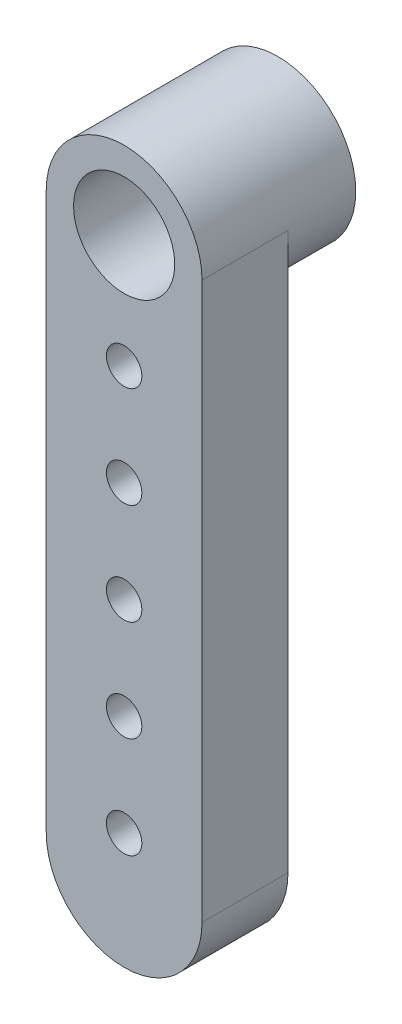
ISO-10303-21;
HEADER;
FILE_DESCRIPTION(('STEP AP214'),'2;1');
FILE_NAME('part.step','',(''),(''),'','','');
FILE_SCHEMA(('AUTOMOTIVE_DESIGN { 1 0 10303 214 1 1 1 1 }'));
ENDSEC;
DATA;
#1=APPLICATION_CONTEXT('core data for automotive mechanical design processes');
#2=APPLICATION_PROTOCOL_DEFINITION('international standard','automotive_design',2000,#1);
#3=PRODUCT_CONTEXT('',#1,'mechanical');
#4=PRODUCT('Part','Part','',(#3));
#5=PRODUCT_RELATED_PRODUCT_CATEGORY('part','',(#4));
#6=PRODUCT_DEFINITION_FORMATION('','',#4);
#7=PRODUCT_DEFINITION_CONTEXT('part definition',#1,'design');
#8=PRODUCT_DEFINITION('design','',#6,#7);
#9=PRODUCT_DEFINITION_SHAPE('','',#8);
#10=(LENGTH_UNIT() NAMED_UNIT(*) SI_UNIT(.MILLI.,.METRE.));
#11=(NAMED_UNIT(*) PLANE_ANGLE_UNIT() SI_UNIT($,.RADIAN.));
#12=(NAMED_UNIT(*) SI_UNIT($,.STERADIAN.) SOLID_ANGLE_UNIT());
#13=UNCERTAINTY_MEASURE_WITH_UNIT(LENGTH_MEASURE(1.E-05),#10,'distance_accuracy_value','');
#14=(GEOMETRIC_REPRESENTATION_CONTEXT(3) GLOBAL_UNCERTAINTY_ASSIGNED_CONTEXT((#13)) GLOBAL_UNIT_ASSIGNED_CONTEXT((#10,
#11,#12)) REPRESENTATION_CONTEXT('',''));
#15=CARTESIAN_POINT('',(0.,0.,0.));
#16=DIRECTION('',(0.,0.,1.));
#17=DIRECTION('',(1.,0.,0.));
#18=AXIS2_PLACEMENT_3D('',#15,#16,#17);
#19=CARTESIAN_POINT('',(1.9558,0.,-2.159));
#20=DIRECTION('',(-1.,0.,0.));
#21=DIRECTION('',(0.,-1.,0.));
#22=AXIS2_PLACEMENT_3D('',#19,#20,#21);
#23=PLANE('',#22);
#24=DIRECTION('',(0.,-1.,0.));
#25=VECTOR('',#24,1.);
#26=CARTESIAN_POINT('',(1.9558,0.,0.));
#27=LINE('',#26,#25);
#28=CARTESIAN_POINT('',(1.9558,0.,0.));
#29=VERTEX_POINT('',#28);
#30=CARTESIAN_POINT('',(1.9558,-13.97,0.));
#31=VERTEX_POINT('',#30);
#32=EDGE_CURVE('E81',#29,#31,#27,.T.);
#33=ORIENTED_EDGE('',*,*,#32,.T.);
#34=DIRECTION('',(0.,0.,1.));
#35=VECTOR('',#34,1.);
#36=CARTESIAN_POINT('',(1.9558,-13.97,-2.159));
#37=LINE('',#36,#35);
#38=CARTESIAN_POINT('',(1.9558,-13.97,-2.159));
#39=VERTEX_POINT('',#38);
#40=EDGE_CURVE('E45',#39,#31,#37,.T.);
#41=ORIENTED_EDGE('',*,*,#40,.F.);
#42=DIRECTION('',(0.,-1.,0.));
#43=VECTOR('',#42,1.);
#44=CARTESIAN_POINT('',(1.9558,0.,-2.159));
#45=LINE('',#44,#43);
#46=CARTESIAN_POINT('',(1.9558,0.,-2.159));
#47=VERTEX_POINT('',#46);
#48=EDGE_CURVE('E53',#47,#39,#45,.T.);
#49=ORIENTED_EDGE('',*,*,#48,.F.);
#50=DIRECTION('',(0.,0.,1.));
#51=VECTOR('',#50,1.);
#52=CARTESIAN_POINT('',(1.9558,0.,-2.159));
#53=LINE('',#52,#51);
#54=EDGE_CURVE('E11',#47,#29,#53,.T.);
#55=ORIENTED_EDGE('',*,*,#54,.T.);
#56=EDGE_LOOP('',(#33,#41,#49,#55));
#57=FACE_BOUND('',#56,.T.);
#58=ADVANCED_FACE('F35',(#57),#23,.F.);
#59=CARTESIAN_POINT('',(0.,-13.97,-2.159));
#60=DIRECTION('',(0.,0.,1.));
#61=DIRECTION('',(1.,0.,0.));
#62=AXIS2_PLACEMENT_3D('',#59,#60,#61);
#63=CYLINDRICAL_SURFACE('',#62,1.9558);
#64=CARTESIAN_POINT('',(0.,-13.97,0.));
#65=DIRECTION('',(0.,0.,1.));
#66=DIRECTION('',(1.,0.,0.));
#67=AXIS2_PLACEMENT_3D('',#64,#65,#66);
#68=CIRCLE('',#67,1.9558);
#69=CARTESIAN_POINT('',(-1.9558,-13.97,0.));
#70=VERTEX_POINT('',#69);
#71=EDGE_CURVE('E91',#70,#31,#68,.T.);
#72=ORIENTED_EDGE('',*,*,#71,.F.);
#73=DIRECTION('',(0.,0.,1.));
#74=VECTOR('',#73,1.);
#75=CARTESIAN_POINT('',(-1.9558,-13.97,-2.159));
#76=LINE('',#75,#74);
#77=CARTESIAN_POINT('',(-1.9558,-13.97,-2.159));
#78=VERTEX_POINT('',#77);
#79=EDGE_CURVE('E67',#78,#70,#76,.T.);
#80=ORIENTED_EDGE('',*,*,#79,.F.);
#81=CARTESIAN_POINT('',(0.,-13.97,-2.159));
#82=DIRECTION('',(0.,0.,1.));
#83=DIRECTION('',(1.,0.,0.));
#84=AXIS2_PLACEMENT_3D('',#81,#82,#83);
#85=CIRCLE('',#84,1.9558);
#86=EDGE_CURVE('E124',#78,#39,#85,.T.);
#87=ORIENTED_EDGE('',*,*,#86,.T.);
#88=ORIENTED_EDGE('',*,*,#40,.T.);
#89=EDGE_LOOP('',(#72,#80,#87,#88));
#90=FACE_BOUND('',#89,.T.);
#91=ADVANCED_FACE('F159',(#90),#63,.T.);
#92=CARTESIAN_POINT('',(0.,-13.0048,-2.159));
#93=DIRECTION('',(0.,0.,1.));
#94=DIRECTION('',(1.,0.,0.));
#95=AXIS2_PLACEMENT_3D('',#92,#93,#94);
#96=CYLINDRICAL_SURFACE('',#95,0.4445);
#97=CARTESIAN_POINT('',(0.,-13.0048,-2.159));
#98=DIRECTION('',(0.,0.,1.));
#99=DIRECTION('',(1.,0.,0.));
#100=AXIS2_PLACEMENT_3D('',#97,#98,#99);
#101=CIRCLE('',#100,0.4445);
#102=CARTESIAN_POINT('',(0.444500000000001,-13.0048,-2.159));
#103=VERTEX_POINT('',#102);
#104=EDGE_CURVE('E117',#103,#103,#101,.T.);
#105=ORIENTED_EDGE('',*,*,#104,.F.);
#106=EDGE_LOOP('',(#105));
#107=FACE_BOUND('',#106,.T.);
#108=CARTESIAN_POINT('',(0.,-13.0048,0.));
#109=DIRECTION('',(0.,0.,1.));
#110=DIRECTION('',(1.,0.,0.));
#111=AXIS2_PLACEMENT_3D('',#108,#109,#110);
#112=CIRCLE('',#111,0.4445);
#113=CARTESIAN_POINT('',(0.444500000000001,-13.0048,0.));
#114=VERTEX_POINT('',#113);
#115=EDGE_CURVE('E138',#114,#114,#112,.T.);
#116=ORIENTED_EDGE('',*,*,#115,.T.);
#117=EDGE_LOOP('',(#116));
#118=FACE_BOUND('',#117,.T.);
#119=ADVANCED_FACE('F164',(#107,#118),#96,.F.);
#120=CARTESIAN_POINT('',(0.,-10.4648,-2.159));
#121=DIRECTION('',(0.,0.,1.));
#122=DIRECTION('',(1.,0.,0.));
#123=AXIS2_PLACEMENT_3D('',#120,#121,#122);
#124=CYLINDRICAL_SURFACE('',#123,0.4445);
#125=CARTESIAN_POINT('',(0.,-10.4648,-2.159));
#126=DIRECTION('',(0.,0.,1.));
#127=DIRECTION('',(1.,0.,0.));
#128=AXIS2_PLACEMENT_3D('',#125,#126,#127);
#129=CIRCLE('',#128,0.4445);
#130=CARTESIAN_POINT('',(0.444499999999993,-10.4648,-2.159));
#131=VERTEX_POINT('',#130);
#132=EDGE_CURVE('E114',#131,#131,#129,.T.);
#133=ORIENTED_EDGE('',*,*,#132,.F.);
#134=EDGE_LOOP('',(#133));
#135=FACE_BOUND('',#134,.T.);
#136=CARTESIAN_POINT('',(0.,-10.4648,0.));
#137=DIRECTION('',(0.,0.,1.));
#138=DIRECTION('',(1.,0.,0.));
#139=AXIS2_PLACEMENT_3D('',#136,#137,#138);
#140=CIRCLE('',#139,0.4445);
#141=CARTESIAN_POINT('',(0.444499999999993,-10.4648,0.));
#142=VERTEX_POINT('',#141);
#143=EDGE_CURVE('E135',#142,#142,#140,.T.);
#144=ORIENTED_EDGE('',*,*,#143,.T.);
#145=EDGE_LOOP('',(#144));
#146=FACE_BOUND('',#145,.T.);
#147=ADVANCED_FACE('F199',(#135,#146),#124,.F.);
#148=CARTESIAN_POINT('',(0.,-7.9248,-2.159));
#149=DIRECTION('',(0.,0.,1.));
#150=DIRECTION('',(1.,0.,0.));
#151=AXIS2_PLACEMENT_3D('',#148,#149,#150);
#152=CYLINDRICAL_SURFACE('',#151,0.4445);
#153=CARTESIAN_POINT('',(0.,-7.9248,-2.159));
#154=DIRECTION('',(0.,0.,1.));
#155=DIRECTION('',(1.,0.,0.));
#156=AXIS2_PLACEMENT_3D('',#153,#154,#155);
#157=CIRCLE('',#156,0.4445);
#158=CARTESIAN_POINT('',(0.444499999999983,-7.9248,-2.159));
#159=VERTEX_POINT('',#158);
#160=EDGE_CURVE('E111',#159,#159,#157,.T.);
#161=ORIENTED_EDGE('',*,*,#160,.F.);
#162=EDGE_LOOP('',(#161));
#163=FACE_BOUND('',#162,.T.);
#164=CARTESIAN_POINT('',(0.,-7.9248,0.));
#165=DIRECTION('',(0.,0.,1.));
#166=DIRECTION('',(1.,0.,0.));
#167=AXIS2_PLACEMENT_3D('',#164,#165,#166);
#168=CIRCLE('',#167,0.4445);
#169=CARTESIAN_POINT('',(0.444499999999983,-7.9248,0.));
#170=VERTEX_POINT('',#169);
#171=EDGE_CURVE('E132',#170,#170,#168,.T.);
#172=ORIENTED_EDGE('',*,*,#171,.T.);
#173=EDGE_LOOP('',(#172));
#174=FACE_BOUND('',#173,.T.);
#175=ADVANCED_FACE('F204',(#163,#174),#152,.F.);
#176=CARTESIAN_POINT('',(0.,-5.3848,-2.159));
#177=DIRECTION('',(0.,0.,1.));
#178=DIRECTION('',(1.,0.,0.));
#179=AXIS2_PLACEMENT_3D('',#176,#177,#178);
#180=CYLINDRICAL_SURFACE('',#179,0.444499999999999);
#181=CARTESIAN_POINT('',(0.,-5.3848,-2.159));
#182=DIRECTION('',(0.,0.,1.));
#183=DIRECTION('',(1.,0.,0.));
#184=AXIS2_PLACEMENT_3D('',#181,#182,#183);
#185=CIRCLE('',#184,0.444499999999999);
#186=CARTESIAN_POINT('',(0.444499999999974,-5.3848,-2.159));
#187=VERTEX_POINT('',#186);
#188=EDGE_CURVE('E108',#187,#187,#185,.T.);
#189=ORIENTED_EDGE('',*,*,#188,.F.);
#190=EDGE_LOOP('',(#189));
#191=FACE_BOUND('',#190,.T.);
#192=CARTESIAN_POINT('',(0.,-5.3848,0.));
#193=DIRECTION('',(0.,0.,1.));
#194=DIRECTION('',(1.,0.,0.));
#195=AXIS2_PLACEMENT_3D('',#192,#193,#194);
#196=CIRCLE('',#195,0.444499999999999);
#197=CARTESIAN_POINT('',(0.444499999999974,-5.3848,0.));
#198=VERTEX_POINT('',#197);
#199=EDGE_CURVE('E129',#198,#198,#196,.T.);
#200=ORIENTED_EDGE('',*,*,#199,.T.);
#201=EDGE_LOOP('',(#200));
#202=FACE_BOUND('',#201,.T.);
#203=ADVANCED_FACE('F154',(#191,#202),#180,.F.);
#204=CARTESIAN_POINT('',(0.,-2.8448,-2.159));
#205=DIRECTION('',(0.,0.,1.));
#206=DIRECTION('',(1.,0.,0.));
#207=AXIS2_PLACEMENT_3D('',#204,#205,#206);
#208=CYLINDRICAL_SURFACE('',#207,0.444499999999999);
#209=CARTESIAN_POINT('',(0.,-2.8448,-2.159));
#210=DIRECTION('',(0.,0.,1.));
#211=DIRECTION('',(1.,0.,0.));
#212=AXIS2_PLACEMENT_3D('',#209,#210,#211);
#213=CIRCLE('',#212,0.444499999999999);
#214=CARTESIAN_POINT('',(0.444499999999965,-2.8448,-2.159));
#215=VERTEX_POINT('',#214);
#216=EDGE_CURVE('E92',#215,#215,#213,.T.);
#217=ORIENTED_EDGE('',*,*,#216,.F.);
#218=EDGE_LOOP('',(#217));
#219=FACE_BOUND('',#218,.T.);
#220=CARTESIAN_POINT('',(0.,-2.8448,0.));
#221=DIRECTION('',(0.,0.,1.));
#222=DIRECTION('',(1.,0.,0.));
#223=AXIS2_PLACEMENT_3D('',#220,#221,#222);
#224=CIRCLE('',#223,0.444499999999999);
#225=CARTESIAN_POINT('',(0.444499999999965,-2.8448,0.));
#226=VERTEX_POINT('',#225);
#227=EDGE_CURVE('E99',#226,#226,#224,.T.);
#228=ORIENTED_EDGE('',*,*,#227,.T.);
#229=EDGE_LOOP('',(#228));
#230=FACE_BOUND('',#229,.T.);
#231=ADVANCED_FACE('F37',(#219,#230),#208,.F.);
#232=CARTESIAN_POINT('',(-1.9558,0.,-2.159));
#233=DIRECTION('',(-1.,0.,0.));
#234=DIRECTION('',(0.,-1.,0.));
#235=AXIS2_PLACEMENT_3D('',#232,#233,#234);
#236=PLANE('',#235);
#237=DIRECTION('',(0.,-1.,0.));
#238=VECTOR('',#237,1.);
#239=CARTESIAN_POINT('',(-1.9558,0.,0.));
#240=LINE('',#239,#238);
#241=CARTESIAN_POINT('',(-1.9558,0.,0.));
#242=VERTEX_POINT('',#241);
#243=EDGE_CURVE('E141',#242,#70,#240,.T.);
#244=ORIENTED_EDGE('',*,*,#243,.F.);
#245=DIRECTION('',(0.,0.,1.));
#246=VECTOR('',#245,1.);
#247=CARTESIAN_POINT('',(-1.9558,0.,-2.159));
#248=LINE('',#247,#246);
#249=CARTESIAN_POINT('',(-1.9558,0.,-2.159));
#250=VERTEX_POINT('',#249);
#251=EDGE_CURVE('E39',#250,#242,#248,.T.);
#252=ORIENTED_EDGE('',*,*,#251,.F.);
#253=DIRECTION('',(0.,-1.,0.));
#254=VECTOR('',#253,1.);
#255=CARTESIAN_POINT('',(-1.9558,0.,-2.159));
#256=LINE('',#255,#254);
#257=EDGE_CURVE('E122',#250,#78,#256,.T.);
#258=ORIENTED_EDGE('',*,*,#257,.T.);
#259=ORIENTED_EDGE('',*,*,#79,.T.);
#260=EDGE_LOOP('',(#244,#252,#258,#259));
#261=FACE_BOUND('',#260,.T.);
#262=ADVANCED_FACE('F144',(#261),#236,.T.);
#263=CARTESIAN_POINT('',(0.,0.,-2.159));
#264=DIRECTION('',(0.,0.,1.));
#265=DIRECTION('',(1.,0.,0.));
#266=AXIS2_PLACEMENT_3D('',#263,#264,#265);
#267=PLANE('',#266);
#268=ORIENTED_EDGE('',*,*,#216,.T.);
#269=EDGE_LOOP('',(#268));
#270=FACE_BOUND('',#269,.T.);
#271=ORIENTED_EDGE('',*,*,#188,.T.);
#272=EDGE_LOOP('',(#271));
#273=FACE_BOUND('',#272,.T.);
#274=ORIENTED_EDGE('',*,*,#160,.T.);
#275=EDGE_LOOP('',(#274));
#276=FACE_BOUND('',#275,.T.);
#277=ORIENTED_EDGE('',*,*,#132,.T.);
#278=EDGE_LOOP('',(#277));
#279=FACE_BOUND('',#278,.T.);
#280=ORIENTED_EDGE('',*,*,#104,.T.);
#281=EDGE_LOOP('',(#280));
#282=FACE_BOUND('',#281,.T.);
#283=CARTESIAN_POINT('',(0.,0.,-2.159));
#284=DIRECTION('',(0.,0.,1.));
#285=DIRECTION('',(1.,0.,0.));
#286=AXIS2_PLACEMENT_3D('',#283,#284,#285);
#287=CIRCLE('',#286,1.9558);
#288=EDGE_CURVE('E120',#250,#47,#287,.T.);
#289=ORIENTED_EDGE('',*,*,#288,.T.);
#290=ORIENTED_EDGE('',*,*,#48,.T.);
#291=ORIENTED_EDGE('',*,*,#86,.F.);
#292=ORIENTED_EDGE('',*,*,#257,.F.);
#293=EDGE_LOOP('',(#289,#290,#291,#292));
#294=FACE_BOUND('',#293,.T.);
#295=ADVANCED_FACE('F146',(#270,#273,#276,#279,#282,#294),#267,.F.);
#296=CARTESIAN_POINT('',(0.,0.,0.));
#297=DIRECTION('',(0.,0.,1.));
#298=DIRECTION('',(1.,0.,0.));
#299=AXIS2_PLACEMENT_3D('',#296,#297,#298);
#300=PLANE('',#299);
#301=CARTESIAN_POINT('',(0.,0.,0.));
#302=DIRECTION('',(0.,0.,-1.));
#303=DIRECTION('',(-1.,0.,0.));
#304=AXIS2_PLACEMENT_3D('',#301,#302,#303);
#305=CIRCLE('',#304,1.27);
#306=CARTESIAN_POINT('',(-1.27,0.,0.));
#307=VERTEX_POINT('',#306);
#308=EDGE_CURVE('E96',#307,#307,#305,.T.);
#309=ORIENTED_EDGE('',*,*,#308,.T.);
#310=EDGE_LOOP('',(#309));
#311=FACE_BOUND('',#310,.T.);
#312=ORIENTED_EDGE('',*,*,#227,.F.);
#313=EDGE_LOOP('',(#312));
#314=FACE_BOUND('',#313,.T.);
#315=ORIENTED_EDGE('',*,*,#199,.F.);
#316=EDGE_LOOP('',(#315));
#317=FACE_BOUND('',#316,.T.);
#318=ORIENTED_EDGE('',*,*,#171,.F.);
#319=EDGE_LOOP('',(#318));
#320=FACE_BOUND('',#319,.T.);
#321=ORIENTED_EDGE('',*,*,#143,.F.);
#322=EDGE_LOOP('',(#321));
#323=FACE_BOUND('',#322,.T.);
#324=ORIENTED_EDGE('',*,*,#115,.F.);
#325=EDGE_LOOP('',(#324));
#326=FACE_BOUND('',#325,.T.);
#327=ORIENTED_EDGE('',*,*,#32,.F.);
#328=CARTESIAN_POINT('',(0.,0.,0.));
#329=DIRECTION('',(0.,0.,1.));
#330=DIRECTION('',(1.,0.,0.));
#331=AXIS2_PLACEMENT_3D('',#328,#329,#330);
#332=CIRCLE('',#331,1.9558);
#333=EDGE_CURVE('E90',#29,#242,#332,.T.);
#334=ORIENTED_EDGE('',*,*,#333,.T.);
#335=ORIENTED_EDGE('',*,*,#243,.T.);
#336=ORIENTED_EDGE('',*,*,#71,.T.);
#337=EDGE_LOOP('',(#327,#334,#335,#336));
#338=FACE_BOUND('',#337,.T.);
#339=ADVANCED_FACE('F88',(#311,#314,#317,#320,#323,#326,#338),#300,.T.);
#340=CARTESIAN_POINT('',(0.,0.,-3.8608));
#341=DIRECTION('',(0.,0.,1.));
#342=DIRECTION('',(1.,0.,0.));
#343=AXIS2_PLACEMENT_3D('',#340,#341,#342);
#344=CYLINDRICAL_SURFACE('',#343,1.9558);
#345=CARTESIAN_POINT('',(0.,0.,-3.8608));
#346=DIRECTION('',(0.,0.,1.));
#347=DIRECTION('',(1.,0.,0.));
#348=AXIS2_PLACEMENT_3D('',#345,#346,#347);
#349=CIRCLE('',#348,1.9558);
#350=CARTESIAN_POINT('',(1.9558,0.,-3.8608));
#351=VERTEX_POINT('',#350);
#352=EDGE_CURVE('E95',#351,#351,#349,.T.);
#353=ORIENTED_EDGE('',*,*,#352,.T.);
#354=EDGE_LOOP('',(#353));
#355=FACE_BOUND('',#354,.T.);
#356=ORIENTED_EDGE('',*,*,#54,.F.);
#357=ORIENTED_EDGE('',*,*,#288,.F.);
#358=ORIENTED_EDGE('',*,*,#251,.T.);
#359=ORIENTED_EDGE('',*,*,#333,.F.);
#360=EDGE_LOOP('',(#356,#357,#358,#359));
#361=FACE_BOUND('',#360,.T.);
#362=ADVANCED_FACE('F94',(#355,#361),#344,.T.);
#363=CARTESIAN_POINT('',(0.,0.,-3.8608));
#364=DIRECTION('',(0.,0.,1.));
#365=DIRECTION('',(1.,0.,0.));
#366=AXIS2_PLACEMENT_3D('',#363,#364,#365);
#367=PLANE('',#366);
#368=CARTESIAN_POINT('',(0.,0.,-3.8608));
#369=DIRECTION('',(0.,0.,-1.));
#370=DIRECTION('',(-1.,0.,0.));
#371=AXIS2_PLACEMENT_3D('',#368,#369,#370);
#372=CIRCLE('',#371,1.27);
#373=CARTESIAN_POINT('',(-1.27,0.,-3.8608));
#374=VERTEX_POINT('',#373);
#375=EDGE_CURVE('E102',#374,#374,#372,.T.);
#376=ORIENTED_EDGE('',*,*,#375,.F.);
#377=EDGE_LOOP('',(#376));
#378=FACE_BOUND('',#377,.T.);
#379=ORIENTED_EDGE('',*,*,#352,.F.);
#380=EDGE_LOOP('',(#379));
#381=FACE_BOUND('',#380,.T.);
#382=ADVANCED_FACE('F171',(#378,#381),#367,.F.);
#383=CARTESIAN_POINT('',(0.,0.,0.));
#384=DIRECTION('',(0.,0.,-1.));
#385=DIRECTION('',(-1.,0.,0.));
#386=AXIS2_PLACEMENT_3D('',#383,#384,#385);
#387=CYLINDRICAL_SURFACE('',#386,1.27);
#388=CARTESIAN_POINT('',(-1.27,0.,0.));
#389=CARTESIAN_POINT('',(-1.27,0.,-0.0402166666666666));
#390=CARTESIAN_POINT('',(-1.27,0.,-0.0804333333333333));
#391=CARTESIAN_POINT('',(-1.27,0.,-0.160866666666667));
#392=CARTESIAN_POINT('',(-1.27,0.,-0.201083333333333));
#393=CARTESIAN_POINT('',(-1.27,0.,-0.281516666666667));
#394=CARTESIAN_POINT('',(-1.27,0.,-0.321733333333333));
#395=CARTESIAN_POINT('',(-1.27,0.,-0.402166666666667));
#396=CARTESIAN_POINT('',(-1.27,0.,-0.442383333333333));
#397=CARTESIAN_POINT('',(-1.27,0.,-0.522816666666667));
#398=CARTESIAN_POINT('',(-1.27,0.,-0.563033333333333));
#399=CARTESIAN_POINT('',(-1.27,0.,-0.643466666666667));
#400=CARTESIAN_POINT('',(-1.27,0.,-0.683683333333333));
#401=CARTESIAN_POINT('',(-1.27,0.,-0.764116666666667));
#402=CARTESIAN_POINT('',(-1.27,0.,-0.804333333333333));
#403=CARTESIAN_POINT('',(-1.27,0.,-0.884766666666667));
#404=CARTESIAN_POINT('',(-1.27,0.,-0.924983333333333));
#405=CARTESIAN_POINT('',(-1.27,0.,-1.00541666666667));
#406=CARTESIAN_POINT('',(-1.27,0.,-1.04563333333333));
#407=CARTESIAN_POINT('',(-1.27,0.,-1.12606666666667));
#408=CARTESIAN_POINT('',(-1.27,0.,-1.16628333333333));
#409=CARTESIAN_POINT('',(-1.27,0.,-1.24671666666667));
#410=CARTESIAN_POINT('',(-1.27,0.,-1.28693333333333));
#411=CARTESIAN_POINT('',(-1.27,0.,-1.36736666666667));
#412=CARTESIAN_POINT('',(-1.27,0.,-1.40758333333333));
#413=CARTESIAN_POINT('',(-1.27,0.,-1.48801666666667));
#414=CARTESIAN_POINT('',(-1.27,0.,-1.52823333333333));
#415=CARTESIAN_POINT('',(-1.27,0.,-1.60866666666667));
#416=CARTESIAN_POINT('',(-1.27,0.,-1.64888333333333));
#417=CARTESIAN_POINT('',(-1.27,0.,-1.72931666666667));
#418=CARTESIAN_POINT('',(-1.27,0.,-1.76953333333333));
#419=CARTESIAN_POINT('',(-1.27,0.,-1.84996666666667));
#420=CARTESIAN_POINT('',(-1.27,0.,-1.89018333333333));
#421=CARTESIAN_POINT('',(-1.27,0.,-1.97061666666667));
#422=CARTESIAN_POINT('',(-1.27,0.,-2.01083333333333));
#423=CARTESIAN_POINT('',(-1.27,0.,-2.09126666666667));
#424=CARTESIAN_POINT('',(-1.27,0.,-2.13148333333333));
#425=CARTESIAN_POINT('',(-1.27,0.,-2.21191666666667));
#426=CARTESIAN_POINT('',(-1.27,0.,-2.25213333333333));
#427=CARTESIAN_POINT('',(-1.27,0.,-2.33256666666667));
#428=CARTESIAN_POINT('',(-1.27,0.,-2.37278333333333));
#429=CARTESIAN_POINT('',(-1.27,0.,-2.45321666666667));
#430=CARTESIAN_POINT('',(-1.27,0.,-2.49343333333333));
#431=CARTESIAN_POINT('',(-1.27,0.,-2.57386666666667));
#432=CARTESIAN_POINT('',(-1.27,0.,-2.61408333333333));
#433=CARTESIAN_POINT('',(-1.27,0.,-2.69451666666667));
#434=CARTESIAN_POINT('',(-1.27,0.,-2.73473333333333));
#435=CARTESIAN_POINT('',(-1.27,0.,-2.81516666666667));
#436=CARTESIAN_POINT('',(-1.27,0.,-2.85538333333333));
#437=CARTESIAN_POINT('',(-1.27,0.,-2.93581666666667));
#438=CARTESIAN_POINT('',(-1.27,0.,-2.97603333333333));
#439=CARTESIAN_POINT('',(-1.27,0.,-3.05646666666667));
#440=CARTESIAN_POINT('',(-1.27,0.,-3.09668333333333));
#441=CARTESIAN_POINT('',(-1.27,0.,-3.17711666666667));
#442=CARTESIAN_POINT('',(-1.27,0.,-3.21733333333333));
#443=CARTESIAN_POINT('',(-1.27,0.,-3.29776666666667));
#444=CARTESIAN_POINT('',(-1.27,0.,-3.33798333333333));
#445=CARTESIAN_POINT('',(-1.27,0.,-3.41841666666667));
#446=CARTESIAN_POINT('',(-1.27,0.,-3.45863333333333));
#447=CARTESIAN_POINT('',(-1.27,0.,-3.53906666666667));
#448=CARTESIAN_POINT('',(-1.27,0.,-3.57928333333333));
#449=CARTESIAN_POINT('',(-1.27,0.,-3.65971666666667));
#450=CARTESIAN_POINT('',(-1.27,0.,-3.69993333333333));
#451=CARTESIAN_POINT('',(-1.27,0.,-3.78036666666667));
#452=CARTESIAN_POINT('',(-1.27,0.,-3.82058333333333));
#453=CARTESIAN_POINT('',(-1.27,0.,-3.8608));
#454=B_SPLINE_CURVE_WITH_KNOTS('',3,(#388,#389,#390,#391,#392,#393,#394,#395,#396,#397,#398,
#399,#400,#401,#402,#403,#404,#405,#406,#407,#408,#409,#410,#411,#412,#413,#414,#415,#416,#417,
#418,#419,#420,#421,#422,#423,#424,#425,#426,#427,#428,#429,#430,#431,#432,#433,#434,#435,#436,
#437,#438,#439,#440,#441,#442,#443,#444,#445,#446,#447,#448,#449,#450,#451,#452,#453),
.UNSPECIFIED.,.F.,.F.,(4,2,2,2,2,2,2,2,2,2,2,2,2,2,2,2,2,2,2,2,2,2,2,2,2,2,2,2,2,2,2,2,4),(0.,
0.12065,0.2413,0.36195,0.4826,0.60325,0.7239,0.84455,0.9652,1.08585,1.2065,1.32715,1.4478,
1.56845,1.6891,1.80975,1.9304,2.05105,2.1717,2.29235,2.413,2.53365,2.6543,2.77495,2.8956,
3.01625,3.1369,3.25755,3.3782,3.49885,3.6195,3.74015,3.8608),.UNSPECIFIED.);
#455=EDGE_CURVE('BSEAM175',#307,#374,#454,.T.);
#456=ORIENTED_EDGE('',*,*,#308,.F.);
#457=ORIENTED_EDGE('',*,*,#375,.T.);
#458=ORIENTED_EDGE('',*,*,#455,.T.);
#459=ORIENTED_EDGE('',*,*,#455,.F.);
#460=EDGE_LOOP('',(#456,#458,#457,#459));
#461=FACE_BOUND('',#460,.T.);
#462=ADVANCED_FACE('F175',(#461),#387,.F.);
#463=CLOSED_SHELL('',(#58,#91,#119,#147,#175,#203,#231,#262,#295,#339,#362,#382,#462));
#464=MANIFOLD_SOLID_BREP('B2',#463);
#465=ADVANCED_BREP_SHAPE_REPRESENTATION('',(#18,#464),#14);
#466=SHAPE_DEFINITION_REPRESENTATION(#9,#465);
ENDSEC;
END-ISO-10303-21;
